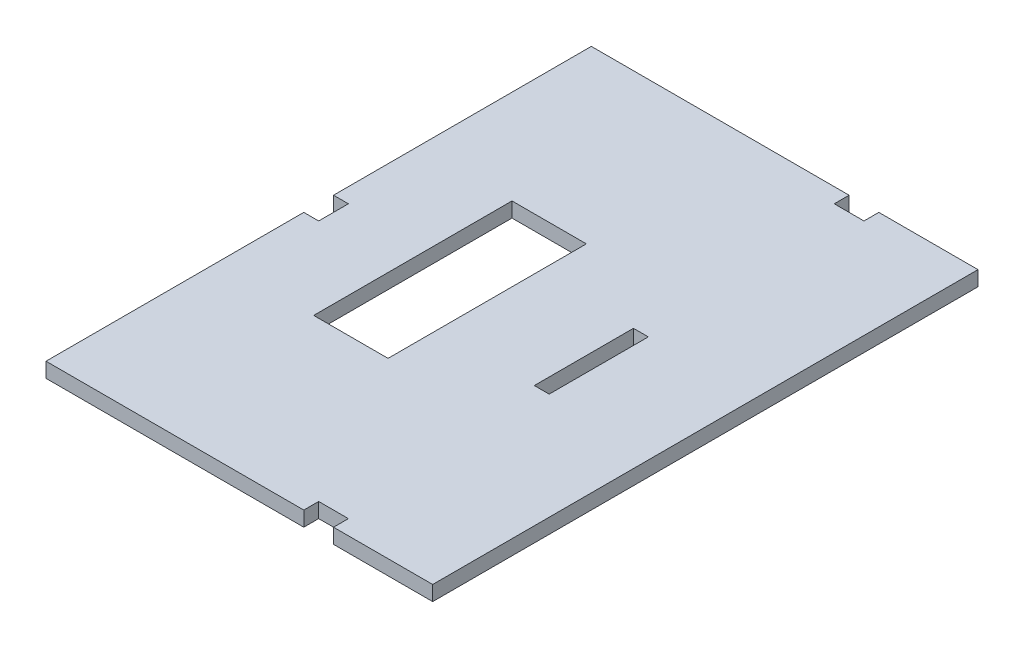
ISO-10303-21;
HEADER;
FILE_DESCRIPTION(('STEP AP214'),'2;1');
FILE_NAME('part.step','',(''),(''),'','','');
FILE_SCHEMA(('AUTOMOTIVE_DESIGN { 1 0 10303 214 1 1 1 1 }'));
ENDSEC;
DATA;
#1=APPLICATION_CONTEXT('core data for automotive mechanical design processes');
#2=APPLICATION_PROTOCOL_DEFINITION('international standard','automotive_design',2000,#1);
#3=PRODUCT_CONTEXT('',#1,'mechanical');
#4=PRODUCT('Part','Part','',(#3));
#5=PRODUCT_RELATED_PRODUCT_CATEGORY('part','',(#4));
#6=PRODUCT_DEFINITION_FORMATION('','',#4);
#7=PRODUCT_DEFINITION_CONTEXT('part definition',#1,'design');
#8=PRODUCT_DEFINITION('design','',#6,#7);
#9=PRODUCT_DEFINITION_SHAPE('','',#8);
#10=(LENGTH_UNIT() NAMED_UNIT(*) SI_UNIT(.MILLI.,.METRE.));
#11=(NAMED_UNIT(*) PLANE_ANGLE_UNIT() SI_UNIT($,.RADIAN.));
#12=(NAMED_UNIT(*) SI_UNIT($,.STERADIAN.) SOLID_ANGLE_UNIT());
#13=UNCERTAINTY_MEASURE_WITH_UNIT(LENGTH_MEASURE(1.E-05),#10,'distance_accuracy_value','');
#14=(GEOMETRIC_REPRESENTATION_CONTEXT(3) GLOBAL_UNCERTAINTY_ASSIGNED_CONTEXT((#13)) GLOBAL_UNIT_ASSIGNED_CONTEXT((#10,
#11,#12)) REPRESENTATION_CONTEXT('',''));
#15=CARTESIAN_POINT('',(0.,0.,0.));
#16=DIRECTION('',(0.,0.,1.));
#17=DIRECTION('',(1.,0.,0.));
#18=AXIS2_PLACEMENT_3D('',#15,#16,#17);
#19=CARTESIAN_POINT('',(0.,3.,-107.));
#20=DIRECTION('',(0.,0.,-1.));
#21=DIRECTION('',(-1.,0.,0.));
#22=AXIS2_PLACEMENT_3D('',#19,#20,#21);
#23=PLANE('',#22);
#24=DIRECTION('',(1.,0.,0.));
#25=VECTOR('',#24,1.);
#26=CARTESIAN_POINT('',(0.,0.,-107.));
#27=LINE('',#26,#25);
#28=CARTESIAN_POINT('',(52.,0.,-107.));
#29=VERTEX_POINT('',#28);
#30=CARTESIAN_POINT('',(58.,0.,-107.));
#31=VERTEX_POINT('',#30);
#32=EDGE_CURVE('E398',#29,#31,#27,.T.);
#33=ORIENTED_EDGE('',*,*,#32,.F.);
#34=DIRECTION('',(0.,-1.,0.));
#35=VECTOR('',#34,1.);
#36=CARTESIAN_POINT('',(52.,3.,-107.));
#37=LINE('',#36,#35);
#38=CARTESIAN_POINT('',(52.,3.,-107.));
#39=VERTEX_POINT('',#38);
#40=EDGE_CURVE('E12',#39,#29,#37,.T.);
#41=ORIENTED_EDGE('',*,*,#40,.F.);
#42=DIRECTION('',(1.,0.,0.));
#43=VECTOR('',#42,1.);
#44=CARTESIAN_POINT('',(0.,3.,-107.));
#45=LINE('',#44,#43);
#46=CARTESIAN_POINT('',(58.,3.,-107.));
#47=VERTEX_POINT('',#46);
#48=EDGE_CURVE('E367',#39,#47,#45,.T.);
#49=ORIENTED_EDGE('',*,*,#48,.T.);
#50=DIRECTION('',(0.,-1.,0.));
#51=VECTOR('',#50,1.);
#52=CARTESIAN_POINT('',(58.,3.,-107.));
#53=LINE('',#52,#51);
#54=EDGE_CURVE('E459',#47,#31,#53,.T.);
#55=ORIENTED_EDGE('',*,*,#54,.T.);
#56=EDGE_LOOP('',(#33,#41,#49,#55));
#57=FACE_BOUND('',#56,.T.);
#58=ADVANCED_FACE('F134',(#57),#23,.T.);
#59=CARTESIAN_POINT('',(0.,0.,0.));
#60=DIRECTION('',(0.,1.,0.));
#61=DIRECTION('',(0.,0.,1.));
#62=AXIS2_PLACEMENT_3D('',#59,#60,#61);
#63=PLANE('',#62);
#64=DIRECTION('',(-1.,0.,0.));
#65=VECTOR('',#64,1.);
#66=CARTESIAN_POINT('',(0.,0.,-75.));
#67=LINE('',#66,#65);
#68=CARTESIAN_POINT('',(34.,0.,-75.0000000000001));
#69=VERTEX_POINT('',#68);
#70=CARTESIAN_POINT('',(19.,0.,-75.));
#71=VERTEX_POINT('',#70);
#72=EDGE_CURVE('E360',#69,#71,#67,.T.);
#73=ORIENTED_EDGE('',*,*,#72,.T.);
#74=DIRECTION('',(0.,0.,1.));
#75=VECTOR('',#74,1.);
#76=CARTESIAN_POINT('',(19.,0.,0.));
#77=LINE('',#76,#75);
#78=CARTESIAN_POINT('',(19.,0.,-35.));
#79=VERTEX_POINT('',#78);
#80=EDGE_CURVE('E363',#71,#79,#77,.T.);
#81=ORIENTED_EDGE('',*,*,#80,.T.);
#82=DIRECTION('',(1.,0.,0.));
#83=VECTOR('',#82,1.);
#84=CARTESIAN_POINT('',(0.,0.,-35.));
#85=LINE('',#84,#83);
#86=CARTESIAN_POINT('',(34.,0.,-35.));
#87=VERTEX_POINT('',#86);
#88=EDGE_CURVE('E357',#79,#87,#85,.T.);
#89=ORIENTED_EDGE('',*,*,#88,.T.);
#90=DIRECTION('',(0.,0.,-1.));
#91=VECTOR('',#90,1.);
#92=CARTESIAN_POINT('',(34.,0.,0.));
#93=LINE('',#92,#91);
#94=EDGE_CURVE('E301',#87,#69,#93,.T.);
#95=ORIENTED_EDGE('',*,*,#94,.T.);
#96=EDGE_LOOP('',(#73,#81,#89,#95));
#97=FACE_BOUND('',#96,.T.);
#98=DIRECTION('',(-1.,0.,0.));
#99=VECTOR('',#98,1.);
#100=CARTESIAN_POINT('',(-6.01370805005288E-13,0.,-64.9999999999995));
#101=LINE('',#100,#99);
#102=CARTESIAN_POINT('',(56.5,0.,-65.));
#103=VERTEX_POINT('',#102);
#104=CARTESIAN_POINT('',(53.5,0.,-65.));
#105=VERTEX_POINT('',#104);
#106=EDGE_CURVE('E351',#103,#105,#101,.T.);
#107=ORIENTED_EDGE('',*,*,#106,.T.);
#108=DIRECTION('',(0.,0.,1.));
#109=VECTOR('',#108,1.);
#110=CARTESIAN_POINT('',(53.5,0.,0.));
#111=LINE('',#110,#109);
#112=CARTESIAN_POINT('',(53.5,0.,-45.));
#113=VERTEX_POINT('',#112);
#114=EDGE_CURVE('E354',#105,#113,#111,.T.);
#115=ORIENTED_EDGE('',*,*,#114,.T.);
#116=DIRECTION('',(1.,0.,0.));
#117=VECTOR('',#116,1.);
#118=CARTESIAN_POINT('',(5.20417042793048E-13,0.,-45.0000000000007));
#119=LINE('',#118,#117);
#120=CARTESIAN_POINT('',(56.5,0.,-45.));
#121=VERTEX_POINT('',#120);
#122=EDGE_CURVE('E325',#113,#121,#119,.T.);
#123=ORIENTED_EDGE('',*,*,#122,.T.);
#124=DIRECTION('',(0.,0.,-1.));
#125=VECTOR('',#124,1.);
#126=CARTESIAN_POINT('',(56.5,0.,0.));
#127=LINE('',#126,#125);
#128=EDGE_CURVE('E348',#121,#103,#127,.T.);
#129=ORIENTED_EDGE('',*,*,#128,.T.);
#130=EDGE_LOOP('',(#107,#115,#123,#129));
#131=FACE_BOUND('',#130,.T.);
#132=ORIENTED_EDGE('',*,*,#32,.T.);
#133=DIRECTION('',(0.,0.,-1.));
#134=VECTOR('',#133,1.);
#135=CARTESIAN_POINT('',(58.,0.,-107.));
#136=LINE('',#135,#134);
#137=CARTESIAN_POINT('',(58.,0.,-110.));
#138=VERTEX_POINT('',#137);
#139=EDGE_CURVE('E448',#31,#138,#136,.T.);
#140=ORIENTED_EDGE('',*,*,#139,.T.);
#141=DIRECTION('',(1.,0.,0.));
#142=VECTOR('',#141,1.);
#143=CARTESIAN_POINT('',(58.,0.,-110.));
#144=LINE('',#143,#142);
#145=CARTESIAN_POINT('',(78.,0.,-110.));
#146=VERTEX_POINT('',#145);
#147=EDGE_CURVE('E467',#138,#146,#144,.T.);
#148=ORIENTED_EDGE('',*,*,#147,.T.);
#149=DIRECTION('',(0.,0.,1.));
#150=VECTOR('',#149,1.);
#151=CARTESIAN_POINT('',(78.,0.,-110.));
#152=LINE('',#151,#150);
#153=CARTESIAN_POINT('',(78.,0.,0.));
#154=VERTEX_POINT('',#153);
#155=EDGE_CURVE('E464',#146,#154,#152,.T.);
#156=ORIENTED_EDGE('',*,*,#155,.T.);
#157=DIRECTION('',(1.,0.,0.));
#158=VECTOR('',#157,1.);
#159=CARTESIAN_POINT('',(58.,0.,0.));
#160=LINE('',#159,#158);
#161=CARTESIAN_POINT('',(58.,0.,0.));
#162=VERTEX_POINT('',#161);
#163=EDGE_CURVE('E461',#162,#154,#160,.T.);
#164=ORIENTED_EDGE('',*,*,#163,.F.);
#165=DIRECTION('',(0.,0.,1.));
#166=VECTOR('',#165,1.);
#167=CARTESIAN_POINT('',(58.,0.,-3.));
#168=LINE('',#167,#166);
#169=CARTESIAN_POINT('',(58.,0.,-3.));
#170=VERTEX_POINT('',#169);
#171=EDGE_CURVE('E366',#170,#162,#168,.T.);
#172=ORIENTED_EDGE('',*,*,#171,.F.);
#173=DIRECTION('',(-1.,0.,0.));
#174=VECTOR('',#173,1.);
#175=CARTESIAN_POINT('',(0.,0.,-3.));
#176=LINE('',#175,#174);
#177=CARTESIAN_POINT('',(52.,0.,-3.));
#178=VERTEX_POINT('',#177);
#179=EDGE_CURVE('E370',#170,#178,#176,.T.);
#180=ORIENTED_EDGE('',*,*,#179,.T.);
#181=DIRECTION('',(0.,0.,1.));
#182=VECTOR('',#181,1.);
#183=CARTESIAN_POINT('',(52.,0.,-2.40548322002117E-13));
#184=LINE('',#183,#182);
#185=CARTESIAN_POINT('',(52.,0.,0.));
#186=VERTEX_POINT('',#185);
#187=EDGE_CURVE('E424',#178,#186,#184,.T.);
#188=ORIENTED_EDGE('',*,*,#187,.T.);
#189=DIRECTION('',(1.,0.,0.));
#190=VECTOR('',#189,1.);
#191=CARTESIAN_POINT('',(0.,0.,0.));
#192=LINE('',#191,#190);
#193=CARTESIAN_POINT('',(0.,0.,0.));
#194=VERTEX_POINT('',#193);
#195=EDGE_CURVE('E421',#194,#186,#192,.T.);
#196=ORIENTED_EDGE('',*,*,#195,.F.);
#197=DIRECTION('',(0.,0.,-1.));
#198=VECTOR('',#197,1.);
#199=CARTESIAN_POINT('',(0.,0.,0.));
#200=LINE('',#199,#198);
#201=CARTESIAN_POINT('',(0.,0.,-52.));
#202=VERTEX_POINT('',#201);
#203=EDGE_CURVE('E418',#194,#202,#200,.T.);
#204=ORIENTED_EDGE('',*,*,#203,.T.);
#205=DIRECTION('',(-1.,0.,0.));
#206=VECTOR('',#205,1.);
#207=CARTESIAN_POINT('',(0.,0.,-52.));
#208=LINE('',#207,#206);
#209=CARTESIAN_POINT('',(3.,0.,-52.));
#210=VERTEX_POINT('',#209);
#211=EDGE_CURVE('E415',#210,#202,#208,.T.);
#212=ORIENTED_EDGE('',*,*,#211,.F.);
#213=DIRECTION('',(0.,0.,-1.));
#214=VECTOR('',#213,1.);
#215=CARTESIAN_POINT('',(3.,0.,0.));
#216=LINE('',#215,#214);
#217=CARTESIAN_POINT('',(3.,0.,-58.));
#218=VERTEX_POINT('',#217);
#219=EDGE_CURVE('E412',#210,#218,#216,.T.);
#220=ORIENTED_EDGE('',*,*,#219,.T.);
#221=DIRECTION('',(-1.,0.,0.));
#222=VECTOR('',#221,1.);
#223=CARTESIAN_POINT('',(0.,0.,-58.));
#224=LINE('',#223,#222);
#225=CARTESIAN_POINT('',(0.,0.,-58.));
#226=VERTEX_POINT('',#225);
#227=EDGE_CURVE('E409',#218,#226,#224,.T.);
#228=ORIENTED_EDGE('',*,*,#227,.T.);
#229=DIRECTION('',(0.,0.,-1.));
#230=VECTOR('',#229,1.);
#231=CARTESIAN_POINT('',(0.,0.,0.));
#232=LINE('',#231,#230);
#233=CARTESIAN_POINT('',(0.,0.,-110.));
#234=VERTEX_POINT('',#233);
#235=EDGE_CURVE('E406',#226,#234,#232,.T.);
#236=ORIENTED_EDGE('',*,*,#235,.T.);
#237=DIRECTION('',(1.,0.,0.));
#238=VECTOR('',#237,1.);
#239=CARTESIAN_POINT('',(0.,0.,-110.));
#240=LINE('',#239,#238);
#241=CARTESIAN_POINT('',(52.,0.,-110.));
#242=VERTEX_POINT('',#241);
#243=EDGE_CURVE('E403',#234,#242,#240,.T.);
#244=ORIENTED_EDGE('',*,*,#243,.T.);
#245=DIRECTION('',(0.,0.,-1.));
#246=VECTOR('',#245,1.);
#247=CARTESIAN_POINT('',(51.9999999999995,0.,2.40548322002115E-13));
#248=LINE('',#247,#246);
#249=EDGE_CURVE('E400',#29,#242,#248,.T.);
#250=ORIENTED_EDGE('',*,*,#249,.F.);
#251=EDGE_LOOP('',(#132,#140,#148,#156,#164,#172,#180,#188,#196,#204,#212,#220,#228,#236,#244,#250));
#252=FACE_BOUND('',#251,.T.);
#253=ADVANCED_FACE('F492',(#97,#131,#252),#63,.F.);
#254=CARTESIAN_POINT('',(0.,3.,-3.));
#255=DIRECTION('',(0.,0.,1.));
#256=DIRECTION('',(1.,0.,0.));
#257=AXIS2_PLACEMENT_3D('',#254,#255,#256);
#258=PLANE('',#257);
#259=ORIENTED_EDGE('',*,*,#179,.F.);
#260=DIRECTION('',(0.,-1.,0.));
#261=VECTOR('',#260,1.);
#262=CARTESIAN_POINT('',(58.,3.,-3.));
#263=LINE('',#262,#261);
#264=CARTESIAN_POINT('',(58.,3.,-3.));
#265=VERTEX_POINT('',#264);
#266=EDGE_CURVE('E138',#265,#170,#263,.T.);
#267=ORIENTED_EDGE('',*,*,#266,.F.);
#268=DIRECTION('',(-1.,0.,0.));
#269=VECTOR('',#268,1.);
#270=CARTESIAN_POINT('',(0.,3.,-3.));
#271=LINE('',#270,#269);
#272=CARTESIAN_POINT('',(52.,3.,-3.));
#273=VERTEX_POINT('',#272);
#274=EDGE_CURVE('E394',#265,#273,#271,.T.);
#275=ORIENTED_EDGE('',*,*,#274,.T.);
#276=DIRECTION('',(0.,-1.,0.));
#277=VECTOR('',#276,1.);
#278=CARTESIAN_POINT('',(52.,3.,-3.));
#279=LINE('',#278,#277);
#280=EDGE_CURVE('E397',#273,#178,#279,.T.);
#281=ORIENTED_EDGE('',*,*,#280,.T.);
#282=EDGE_LOOP('',(#259,#267,#275,#281));
#283=FACE_BOUND('',#282,.T.);
#284=ADVANCED_FACE('F551',(#283),#258,.T.);
#285=CARTESIAN_POINT('',(52.,3.,-2.40548322002117E-13));
#286=DIRECTION('',(1.,0.,0.));
#287=DIRECTION('',(0.,0.,-1.));
#288=AXIS2_PLACEMENT_3D('',#285,#286,#287);
#289=PLANE('',#288);
#290=ORIENTED_EDGE('',*,*,#187,.F.);
#291=ORIENTED_EDGE('',*,*,#280,.F.);
#292=DIRECTION('',(0.,0.,1.));
#293=VECTOR('',#292,1.);
#294=CARTESIAN_POINT('',(52.,3.,-2.40548322002117E-13));
#295=LINE('',#294,#293);
#296=CARTESIAN_POINT('',(52.,3.,0.));
#297=VERTEX_POINT('',#296);
#298=EDGE_CURVE('E391',#273,#297,#295,.T.);
#299=ORIENTED_EDGE('',*,*,#298,.T.);
#300=DIRECTION('',(0.,-1.,0.));
#301=VECTOR('',#300,1.);
#302=CARTESIAN_POINT('',(52.,3.,0.));
#303=LINE('',#302,#301);
#304=EDGE_CURVE('E430',#297,#186,#303,.T.);
#305=ORIENTED_EDGE('',*,*,#304,.T.);
#306=EDGE_LOOP('',(#290,#291,#299,#305));
#307=FACE_BOUND('',#306,.T.);
#308=ADVANCED_FACE('F550',(#307),#289,.T.);
#309=CARTESIAN_POINT('',(0.,3.,0.));
#310=DIRECTION('',(0.,0.,-1.));
#311=DIRECTION('',(-1.,0.,0.));
#312=AXIS2_PLACEMENT_3D('',#309,#310,#311);
#313=PLANE('',#312);
#314=ORIENTED_EDGE('',*,*,#195,.T.);
#315=ORIENTED_EDGE('',*,*,#304,.F.);
#316=DIRECTION('',(1.,0.,0.));
#317=VECTOR('',#316,1.);
#318=CARTESIAN_POINT('',(0.,3.,0.));
#319=LINE('',#318,#317);
#320=CARTESIAN_POINT('',(0.,3.,0.));
#321=VERTEX_POINT('',#320);
#322=EDGE_CURVE('E389',#321,#297,#319,.T.);
#323=ORIENTED_EDGE('',*,*,#322,.F.);
#324=DIRECTION('',(0.,-1.,0.));
#325=VECTOR('',#324,1.);
#326=CARTESIAN_POINT('',(0.,3.,0.));
#327=LINE('',#326,#325);
#328=EDGE_CURVE('E432',#321,#194,#327,.T.);
#329=ORIENTED_EDGE('',*,*,#328,.T.);
#330=EDGE_LOOP('',(#314,#315,#323,#329));
#331=FACE_BOUND('',#330,.T.);
#332=ADVANCED_FACE('F547',(#331),#313,.F.);
#333=CARTESIAN_POINT('',(0.,3.,0.));
#334=DIRECTION('',(-1.,0.,0.));
#335=DIRECTION('',(0.,0.,1.));
#336=AXIS2_PLACEMENT_3D('',#333,#334,#335);
#337=PLANE('',#336);
#338=ORIENTED_EDGE('',*,*,#203,.F.);
#339=ORIENTED_EDGE('',*,*,#328,.F.);
#340=DIRECTION('',(0.,0.,-1.));
#341=VECTOR('',#340,1.);
#342=CARTESIAN_POINT('',(0.,3.,0.));
#343=LINE('',#342,#341);
#344=CARTESIAN_POINT('',(0.,3.,-52.));
#345=VERTEX_POINT('',#344);
#346=EDGE_CURVE('E386',#321,#345,#343,.T.);
#347=ORIENTED_EDGE('',*,*,#346,.T.);
#348=DIRECTION('',(0.,-1.,0.));
#349=VECTOR('',#348,1.);
#350=CARTESIAN_POINT('',(0.,3.,-52.));
#351=LINE('',#350,#349);
#352=EDGE_CURVE('E434',#345,#202,#351,.T.);
#353=ORIENTED_EDGE('',*,*,#352,.T.);
#354=EDGE_LOOP('',(#338,#339,#347,#353));
#355=FACE_BOUND('',#354,.T.);
#356=ADVANCED_FACE('F544',(#355),#337,.T.);
#357=CARTESIAN_POINT('',(0.,3.,-52.));
#358=DIRECTION('',(0.,0.,1.));
#359=DIRECTION('',(1.,0.,0.));
#360=AXIS2_PLACEMENT_3D('',#357,#358,#359);
#361=PLANE('',#360);
#362=ORIENTED_EDGE('',*,*,#211,.T.);
#363=ORIENTED_EDGE('',*,*,#352,.F.);
#364=DIRECTION('',(-1.,0.,0.));
#365=VECTOR('',#364,1.);
#366=CARTESIAN_POINT('',(0.,3.,-52.));
#367=LINE('',#366,#365);
#368=CARTESIAN_POINT('',(3.,3.,-52.));
#369=VERTEX_POINT('',#368);
#370=EDGE_CURVE('E384',#369,#345,#367,.T.);
#371=ORIENTED_EDGE('',*,*,#370,.F.);
#372=DIRECTION('',(0.,-1.,0.));
#373=VECTOR('',#372,1.);
#374=CARTESIAN_POINT('',(3.,3.,-52.));
#375=LINE('',#374,#373);
#376=EDGE_CURVE('E436',#369,#210,#375,.T.);
#377=ORIENTED_EDGE('',*,*,#376,.T.);
#378=EDGE_LOOP('',(#362,#363,#371,#377));
#379=FACE_BOUND('',#378,.T.);
#380=ADVANCED_FACE('F537',(#379),#361,.F.);
#381=CARTESIAN_POINT('',(3.,3.,0.));
#382=DIRECTION('',(-1.,0.,0.));
#383=DIRECTION('',(0.,0.,1.));
#384=AXIS2_PLACEMENT_3D('',#381,#382,#383);
#385=PLANE('',#384);
#386=ORIENTED_EDGE('',*,*,#219,.F.);
#387=ORIENTED_EDGE('',*,*,#376,.F.);
#388=DIRECTION('',(0.,0.,-1.));
#389=VECTOR('',#388,1.);
#390=CARTESIAN_POINT('',(3.,3.,0.));
#391=LINE('',#390,#389);
#392=CARTESIAN_POINT('',(3.,3.,-58.));
#393=VERTEX_POINT('',#392);
#394=EDGE_CURVE('E381',#369,#393,#391,.T.);
#395=ORIENTED_EDGE('',*,*,#394,.T.);
#396=DIRECTION('',(0.,-1.,0.));
#397=VECTOR('',#396,1.);
#398=CARTESIAN_POINT('',(3.,3.,-58.));
#399=LINE('',#398,#397);
#400=EDGE_CURVE('E438',#393,#218,#399,.T.);
#401=ORIENTED_EDGE('',*,*,#400,.T.);
#402=EDGE_LOOP('',(#386,#387,#395,#401));
#403=FACE_BOUND('',#402,.T.);
#404=ADVANCED_FACE('F532',(#403),#385,.T.);
#405=CARTESIAN_POINT('',(0.,3.,-58.));
#406=DIRECTION('',(0.,0.,1.));
#407=DIRECTION('',(1.,0.,0.));
#408=AXIS2_PLACEMENT_3D('',#405,#406,#407);
#409=PLANE('',#408);
#410=ORIENTED_EDGE('',*,*,#227,.F.);
#411=ORIENTED_EDGE('',*,*,#400,.F.);
#412=DIRECTION('',(-1.,0.,0.));
#413=VECTOR('',#412,1.);
#414=CARTESIAN_POINT('',(0.,3.,-58.));
#415=LINE('',#414,#413);
#416=CARTESIAN_POINT('',(0.,3.,-58.));
#417=VERTEX_POINT('',#416);
#418=EDGE_CURVE('E378',#393,#417,#415,.T.);
#419=ORIENTED_EDGE('',*,*,#418,.T.);
#420=DIRECTION('',(0.,-1.,0.));
#421=VECTOR('',#420,1.);
#422=CARTESIAN_POINT('',(0.,3.,-58.));
#423=LINE('',#422,#421);
#424=EDGE_CURVE('E440',#417,#226,#423,.T.);
#425=ORIENTED_EDGE('',*,*,#424,.T.);
#426=EDGE_LOOP('',(#410,#411,#419,#425));
#427=FACE_BOUND('',#426,.T.);
#428=ADVANCED_FACE('F528',(#427),#409,.T.);
#429=CARTESIAN_POINT('',(0.,3.,0.));
#430=DIRECTION('',(-1.,0.,0.));
#431=DIRECTION('',(0.,0.,1.));
#432=AXIS2_PLACEMENT_3D('',#429,#430,#431);
#433=PLANE('',#432);
#434=ORIENTED_EDGE('',*,*,#235,.F.);
#435=ORIENTED_EDGE('',*,*,#424,.F.);
#436=DIRECTION('',(0.,0.,-1.));
#437=VECTOR('',#436,1.);
#438=CARTESIAN_POINT('',(0.,3.,0.));
#439=LINE('',#438,#437);
#440=CARTESIAN_POINT('',(0.,3.,-110.));
#441=VERTEX_POINT('',#440);
#442=EDGE_CURVE('E375',#417,#441,#439,.T.);
#443=ORIENTED_EDGE('',*,*,#442,.T.);
#444=DIRECTION('',(0.,-1.,0.));
#445=VECTOR('',#444,1.);
#446=CARTESIAN_POINT('',(0.,3.,-110.));
#447=LINE('',#446,#445);
#448=EDGE_CURVE('E442',#441,#234,#447,.T.);
#449=ORIENTED_EDGE('',*,*,#448,.T.);
#450=EDGE_LOOP('',(#434,#435,#443,#449));
#451=FACE_BOUND('',#450,.T.);
#452=ADVANCED_FACE('F525',(#451),#433,.T.);
#453=CARTESIAN_POINT('',(0.,3.,-110.));
#454=DIRECTION('',(0.,0.,-1.));
#455=DIRECTION('',(-1.,0.,0.));
#456=AXIS2_PLACEMENT_3D('',#453,#454,#455);
#457=PLANE('',#456);
#458=ORIENTED_EDGE('',*,*,#243,.F.);
#459=ORIENTED_EDGE('',*,*,#448,.F.);
#460=DIRECTION('',(1.,0.,0.));
#461=VECTOR('',#460,1.);
#462=CARTESIAN_POINT('',(0.,3.,-110.));
#463=LINE('',#462,#461);
#464=CARTESIAN_POINT('',(52.,3.,-110.));
#465=VERTEX_POINT('',#464);
#466=EDGE_CURVE('E372',#441,#465,#463,.T.);
#467=ORIENTED_EDGE('',*,*,#466,.T.);
#468=DIRECTION('',(0.,-1.,0.));
#469=VECTOR('',#468,1.);
#470=CARTESIAN_POINT('',(52.,3.,-110.));
#471=LINE('',#470,#469);
#472=EDGE_CURVE('E143',#465,#242,#471,.T.);
#473=ORIENTED_EDGE('',*,*,#472,.T.);
#474=EDGE_LOOP('',(#458,#459,#467,#473));
#475=FACE_BOUND('',#474,.T.);
#476=ADVANCED_FACE('F520',(#475),#457,.T.);
#477=CARTESIAN_POINT('',(51.9999999999995,3.,2.40548322002115E-13));
#478=DIRECTION('',(-1.,0.,0.));
#479=DIRECTION('',(0.,0.,1.));
#480=AXIS2_PLACEMENT_3D('',#477,#478,#479);
#481=PLANE('',#480);
#482=ORIENTED_EDGE('',*,*,#249,.T.);
#483=ORIENTED_EDGE('',*,*,#472,.F.);
#484=DIRECTION('',(0.,0.,-1.));
#485=VECTOR('',#484,1.);
#486=CARTESIAN_POINT('',(51.9999999999995,3.,2.40548322002115E-13));
#487=LINE('',#486,#485);
#488=EDGE_CURVE('E369',#39,#465,#487,.T.);
#489=ORIENTED_EDGE('',*,*,#488,.F.);
#490=ORIENTED_EDGE('',*,*,#40,.T.);
#491=EDGE_LOOP('',(#482,#483,#489,#490));
#492=FACE_BOUND('',#491,.T.);
#493=ADVANCED_FACE('F517',(#492),#481,.F.);
#494=CARTESIAN_POINT('',(0.,3.,0.));
#495=DIRECTION('',(0.,1.,0.));
#496=DIRECTION('',(0.,0.,1.));
#497=AXIS2_PLACEMENT_3D('',#494,#495,#496);
#498=PLANE('',#497);
#499=DIRECTION('',(0.,0.,1.));
#500=VECTOR('',#499,1.);
#501=CARTESIAN_POINT('',(19.,3.,-75.));
#502=LINE('',#501,#500);
#503=CARTESIAN_POINT('',(19.,3.,-75.));
#504=VERTEX_POINT('',#503);
#505=CARTESIAN_POINT('',(19.,3.,-35.));
#506=VERTEX_POINT('',#505);
#507=EDGE_CURVE('E313',#504,#506,#502,.T.);
#508=ORIENTED_EDGE('',*,*,#507,.F.);
#509=DIRECTION('',(-1.,0.,0.));
#510=VECTOR('',#509,1.);
#511=CARTESIAN_POINT('',(19.,3.,-75.));
#512=LINE('',#511,#510);
#513=CARTESIAN_POINT('',(34.,3.,-75.0000000000001));
#514=VERTEX_POINT('',#513);
#515=EDGE_CURVE('E318',#514,#504,#512,.T.);
#516=ORIENTED_EDGE('',*,*,#515,.F.);
#517=DIRECTION('',(0.,0.,-1.));
#518=VECTOR('',#517,1.);
#519=CARTESIAN_POINT('',(34.,3.,-75.0000000000001));
#520=LINE('',#519,#518);
#521=CARTESIAN_POINT('',(34.,3.,-35.));
#522=VERTEX_POINT('',#521);
#523=EDGE_CURVE('E298',#522,#514,#520,.T.);
#524=ORIENTED_EDGE('',*,*,#523,.F.);
#525=DIRECTION('',(1.,0.,0.));
#526=VECTOR('',#525,1.);
#527=CARTESIAN_POINT('',(19.,3.,-35.));
#528=LINE('',#527,#526);
#529=EDGE_CURVE('E308',#506,#522,#528,.T.);
#530=ORIENTED_EDGE('',*,*,#529,.F.);
#531=EDGE_LOOP('',(#508,#516,#524,#530));
#532=FACE_BOUND('',#531,.T.);
#533=DIRECTION('',(0.,0.,1.));
#534=VECTOR('',#533,1.);
#535=CARTESIAN_POINT('',(53.5,3.,-65.));
#536=LINE('',#535,#534);
#537=CARTESIAN_POINT('',(53.5,3.,-65.));
#538=VERTEX_POINT('',#537);
#539=CARTESIAN_POINT('',(53.5,3.,-45.));
#540=VERTEX_POINT('',#539);
#541=EDGE_CURVE('E344',#538,#540,#536,.T.);
#542=ORIENTED_EDGE('',*,*,#541,.F.);
#543=DIRECTION('',(-1.,0.,0.));
#544=VECTOR('',#543,1.);
#545=CARTESIAN_POINT('',(53.5,3.,-65.));
#546=LINE('',#545,#544);
#547=CARTESIAN_POINT('',(56.5,3.,-65.));
#548=VERTEX_POINT('',#547);
#549=EDGE_CURVE('E331',#548,#538,#546,.T.);
#550=ORIENTED_EDGE('',*,*,#549,.F.);
#551=DIRECTION('',(0.,0.,-1.));
#552=VECTOR('',#551,1.);
#553=CARTESIAN_POINT('',(56.5,3.,-65.));
#554=LINE('',#553,#552);
#555=CARTESIAN_POINT('',(56.5,3.,-45.));
#556=VERTEX_POINT('',#555);
#557=EDGE_CURVE('E339',#556,#548,#554,.T.);
#558=ORIENTED_EDGE('',*,*,#557,.F.);
#559=DIRECTION('',(1.,0.,0.));
#560=VECTOR('',#559,1.);
#561=CARTESIAN_POINT('',(53.5,3.,-45.));
#562=LINE('',#561,#560);
#563=EDGE_CURVE('E342',#540,#556,#562,.T.);
#564=ORIENTED_EDGE('',*,*,#563,.F.);
#565=EDGE_LOOP('',(#542,#550,#558,#564));
#566=FACE_BOUND('',#565,.T.);
#567=ORIENTED_EDGE('',*,*,#274,.F.);
#568=DIRECTION('',(0.,0.,1.));
#569=VECTOR('',#568,1.);
#570=CARTESIAN_POINT('',(58.,3.,-3.));
#571=LINE('',#570,#569);
#572=CARTESIAN_POINT('',(58.,3.,0.));
#573=VERTEX_POINT('',#572);
#574=EDGE_CURVE('E445',#265,#573,#571,.T.);
#575=ORIENTED_EDGE('',*,*,#574,.T.);
#576=DIRECTION('',(1.,0.,0.));
#577=VECTOR('',#576,1.);
#578=CARTESIAN_POINT('',(58.,3.,0.));
#579=LINE('',#578,#577);
#580=CARTESIAN_POINT('',(78.,3.,0.));
#581=VERTEX_POINT('',#580);
#582=EDGE_CURVE('E447',#573,#581,#579,.T.);
#583=ORIENTED_EDGE('',*,*,#582,.T.);
#584=DIRECTION('',(0.,0.,1.));
#585=VECTOR('',#584,1.);
#586=CARTESIAN_POINT('',(78.,3.,-110.));
#587=LINE('',#586,#585);
#588=CARTESIAN_POINT('',(78.,3.,-110.));
#589=VERTEX_POINT('',#588);
#590=EDGE_CURVE('E450',#589,#581,#587,.T.);
#591=ORIENTED_EDGE('',*,*,#590,.F.);
#592=DIRECTION('',(1.,0.,0.));
#593=VECTOR('',#592,1.);
#594=CARTESIAN_POINT('',(58.,3.,-110.));
#595=LINE('',#594,#593);
#596=CARTESIAN_POINT('',(58.,3.,-110.));
#597=VERTEX_POINT('',#596);
#598=EDGE_CURVE('E453',#597,#589,#595,.T.);
#599=ORIENTED_EDGE('',*,*,#598,.F.);
#600=DIRECTION('',(0.,0.,-1.));
#601=VECTOR('',#600,1.);
#602=CARTESIAN_POINT('',(58.,3.,-107.));
#603=LINE('',#602,#601);
#604=EDGE_CURVE('E456',#47,#597,#603,.T.);
#605=ORIENTED_EDGE('',*,*,#604,.F.);
#606=ORIENTED_EDGE('',*,*,#48,.F.);
#607=ORIENTED_EDGE('',*,*,#488,.T.);
#608=ORIENTED_EDGE('',*,*,#466,.F.);
#609=ORIENTED_EDGE('',*,*,#442,.F.);
#610=ORIENTED_EDGE('',*,*,#418,.F.);
#611=ORIENTED_EDGE('',*,*,#394,.F.);
#612=ORIENTED_EDGE('',*,*,#370,.T.);
#613=ORIENTED_EDGE('',*,*,#346,.F.);
#614=ORIENTED_EDGE('',*,*,#322,.T.);
#615=ORIENTED_EDGE('',*,*,#298,.F.);
#616=EDGE_LOOP('',(#567,#575,#583,#591,#599,#605,#606,#607,#608,#609,#610,#611,#612,#613,#614,#615));
#617=FACE_BOUND('',#616,.T.);
#618=ADVANCED_FACE('F315',(#532,#566,#617),#498,.T.);
#619=CARTESIAN_POINT('',(58.,3.,-3.));
#620=DIRECTION('',(1.,0.,0.));
#621=DIRECTION('',(0.,0.,-1.));
#622=AXIS2_PLACEMENT_3D('',#619,#620,#621);
#623=PLANE('',#622);
#624=ORIENTED_EDGE('',*,*,#171,.T.);
#625=DIRECTION('',(0.,-1.,0.));
#626=VECTOR('',#625,1.);
#627=CARTESIAN_POINT('',(58.,3.,0.));
#628=LINE('',#627,#626);
#629=EDGE_CURVE('E479',#573,#162,#628,.T.);
#630=ORIENTED_EDGE('',*,*,#629,.F.);
#631=ORIENTED_EDGE('',*,*,#574,.F.);
#632=ORIENTED_EDGE('',*,*,#266,.T.);
#633=EDGE_LOOP('',(#624,#630,#631,#632));
#634=FACE_BOUND('',#633,.T.);
#635=ADVANCED_FACE('F136',(#634),#623,.F.);
#636=CARTESIAN_POINT('',(58.,3.,0.));
#637=DIRECTION('',(0.,0.,-1.));
#638=DIRECTION('',(-1.,0.,0.));
#639=AXIS2_PLACEMENT_3D('',#636,#637,#638);
#640=PLANE('',#639);
#641=ORIENTED_EDGE('',*,*,#163,.T.);
#642=DIRECTION('',(0.,-1.,0.));
#643=VECTOR('',#642,1.);
#644=CARTESIAN_POINT('',(78.,3.,0.));
#645=LINE('',#644,#643);
#646=EDGE_CURVE('E478',#581,#154,#645,.T.);
#647=ORIENTED_EDGE('',*,*,#646,.F.);
#648=ORIENTED_EDGE('',*,*,#582,.F.);
#649=ORIENTED_EDGE('',*,*,#629,.T.);
#650=EDGE_LOOP('',(#641,#647,#648,#649));
#651=FACE_BOUND('',#650,.T.);
#652=ADVANCED_FACE('F495',(#651),#640,.F.);
#653=CARTESIAN_POINT('',(78.,3.,-110.));
#654=DIRECTION('',(1.,0.,0.));
#655=DIRECTION('',(0.,0.,-1.));
#656=AXIS2_PLACEMENT_3D('',#653,#654,#655);
#657=PLANE('',#656);
#658=ORIENTED_EDGE('',*,*,#155,.F.);
#659=DIRECTION('',(0.,-1.,0.));
#660=VECTOR('',#659,1.);
#661=CARTESIAN_POINT('',(78.,3.,-110.));
#662=LINE('',#661,#660);
#663=EDGE_CURVE('E476',#589,#146,#662,.T.);
#664=ORIENTED_EDGE('',*,*,#663,.F.);
#665=ORIENTED_EDGE('',*,*,#590,.T.);
#666=ORIENTED_EDGE('',*,*,#646,.T.);
#667=EDGE_LOOP('',(#658,#664,#665,#666));
#668=FACE_BOUND('',#667,.T.);
#669=ADVANCED_FACE('F498',(#668),#657,.T.);
#670=CARTESIAN_POINT('',(58.,3.,-110.));
#671=DIRECTION('',(0.,0.,-1.));
#672=DIRECTION('',(-1.,0.,0.));
#673=AXIS2_PLACEMENT_3D('',#670,#671,#672);
#674=PLANE('',#673);
#675=ORIENTED_EDGE('',*,*,#147,.F.);
#676=DIRECTION('',(0.,-1.,0.));
#677=VECTOR('',#676,1.);
#678=CARTESIAN_POINT('',(58.,3.,-110.));
#679=LINE('',#678,#677);
#680=EDGE_CURVE('E474',#597,#138,#679,.T.);
#681=ORIENTED_EDGE('',*,*,#680,.F.);
#682=ORIENTED_EDGE('',*,*,#598,.T.);
#683=ORIENTED_EDGE('',*,*,#663,.T.);
#684=EDGE_LOOP('',(#675,#681,#682,#683));
#685=FACE_BOUND('',#684,.T.);
#686=ADVANCED_FACE('F504',(#685),#674,.T.);
#687=CARTESIAN_POINT('',(58.,3.,-107.));
#688=DIRECTION('',(-1.,0.,0.));
#689=DIRECTION('',(0.,0.,1.));
#690=AXIS2_PLACEMENT_3D('',#687,#688,#689);
#691=PLANE('',#690);
#692=ORIENTED_EDGE('',*,*,#139,.F.);
#693=ORIENTED_EDGE('',*,*,#54,.F.);
#694=ORIENTED_EDGE('',*,*,#604,.T.);
#695=ORIENTED_EDGE('',*,*,#680,.T.);
#696=EDGE_LOOP('',(#692,#693,#694,#695));
#697=FACE_BOUND('',#696,.T.);
#698=ADVANCED_FACE('F507',(#697),#691,.T.);
#699=CARTESIAN_POINT('',(53.5,-7.,-65.));
#700=DIRECTION('',(-1.,0.,0.));
#701=DIRECTION('',(0.,0.,1.));
#702=AXIS2_PLACEMENT_3D('',#699,#700,#701);
#703=PLANE('',#702);
#704=DIRECTION('',(0.,1.,0.));
#705=VECTOR('',#704,1.);
#706=CARTESIAN_POINT('',(53.5,-7.,-65.));
#707=LINE('',#706,#705);
#708=EDGE_CURVE('E335',#105,#538,#707,.T.);
#709=ORIENTED_EDGE('',*,*,#708,.T.);
#710=ORIENTED_EDGE('',*,*,#541,.T.);
#711=DIRECTION('',(0.,1.,0.));
#712=VECTOR('',#711,1.);
#713=CARTESIAN_POINT('',(53.5,-7.,-45.));
#714=LINE('',#713,#712);
#715=EDGE_CURVE('E328',#113,#540,#714,.T.);
#716=ORIENTED_EDGE('',*,*,#715,.F.);
#717=ORIENTED_EDGE('',*,*,#114,.F.);
#718=EDGE_LOOP('',(#709,#710,#716,#717));
#719=FACE_BOUND('',#718,.T.);
#720=ADVANCED_FACE('F570',(#719),#703,.F.);
#721=CARTESIAN_POINT('',(53.5,-7.,-65.));
#722=DIRECTION('',(0.,0.,-1.));
#723=DIRECTION('',(-1.,0.,0.));
#724=AXIS2_PLACEMENT_3D('',#721,#722,#723);
#725=PLANE('',#724);
#726=DIRECTION('',(0.,1.,0.));
#727=VECTOR('',#726,1.);
#728=CARTESIAN_POINT('',(56.5,-7.,-65.));
#729=LINE('',#728,#727);
#730=EDGE_CURVE('E333',#103,#548,#729,.T.);
#731=ORIENTED_EDGE('',*,*,#730,.T.);
#732=ORIENTED_EDGE('',*,*,#549,.T.);
#733=ORIENTED_EDGE('',*,*,#708,.F.);
#734=ORIENTED_EDGE('',*,*,#106,.F.);
#735=EDGE_LOOP('',(#731,#732,#733,#734));
#736=FACE_BOUND('',#735,.T.);
#737=ADVANCED_FACE('F586',(#736),#725,.F.);
#738=CARTESIAN_POINT('',(56.5,-7.,-65.));
#739=DIRECTION('',(1.,0.,0.));
#740=DIRECTION('',(0.,0.,-1.));
#741=AXIS2_PLACEMENT_3D('',#738,#739,#740);
#742=PLANE('',#741);
#743=DIRECTION('',(0.,1.,0.));
#744=VECTOR('',#743,1.);
#745=CARTESIAN_POINT('',(56.5,-7.,-45.));
#746=LINE('',#745,#744);
#747=EDGE_CURVE('E159',#121,#556,#746,.T.);
#748=ORIENTED_EDGE('',*,*,#747,.T.);
#749=ORIENTED_EDGE('',*,*,#557,.T.);
#750=ORIENTED_EDGE('',*,*,#730,.F.);
#751=ORIENTED_EDGE('',*,*,#128,.F.);
#752=EDGE_LOOP('',(#748,#749,#750,#751));
#753=FACE_BOUND('',#752,.T.);
#754=ADVANCED_FACE('F589',(#753),#742,.F.);
#755=CARTESIAN_POINT('',(53.5,-7.,-45.));
#756=DIRECTION('',(0.,0.,1.));
#757=DIRECTION('',(1.,0.,0.));
#758=AXIS2_PLACEMENT_3D('',#755,#756,#757);
#759=PLANE('',#758);
#760=ORIENTED_EDGE('',*,*,#715,.T.);
#761=ORIENTED_EDGE('',*,*,#563,.T.);
#762=ORIENTED_EDGE('',*,*,#747,.F.);
#763=ORIENTED_EDGE('',*,*,#122,.F.);
#764=EDGE_LOOP('',(#760,#761,#762,#763));
#765=FACE_BOUND('',#764,.T.);
#766=ADVANCED_FACE('F593',(#765),#759,.F.);
#767=CARTESIAN_POINT('',(19.,-7.,-75.));
#768=DIRECTION('',(-1.,0.,0.));
#769=DIRECTION('',(0.,0.,1.));
#770=AXIS2_PLACEMENT_3D('',#767,#768,#769);
#771=PLANE('',#770);
#772=DIRECTION('',(0.,1.,0.));
#773=VECTOR('',#772,1.);
#774=CARTESIAN_POINT('',(19.,-7.,-75.));
#775=LINE('',#774,#773);
#776=EDGE_CURVE('E323',#71,#504,#775,.T.);
#777=ORIENTED_EDGE('',*,*,#776,.T.);
#778=ORIENTED_EDGE('',*,*,#507,.T.);
#779=DIRECTION('',(0.,1.,0.));
#780=VECTOR('',#779,1.);
#781=CARTESIAN_POINT('',(19.,-7.,-35.));
#782=LINE('',#781,#780);
#783=EDGE_CURVE('E304',#79,#506,#782,.T.);
#784=ORIENTED_EDGE('',*,*,#783,.F.);
#785=ORIENTED_EDGE('',*,*,#80,.F.);
#786=EDGE_LOOP('',(#777,#778,#784,#785));
#787=FACE_BOUND('',#786,.T.);
#788=ADVANCED_FACE('F597',(#787),#771,.F.);
#789=CARTESIAN_POINT('',(19.,-7.,-75.));
#790=DIRECTION('',(0.,0.,-1.));
#791=DIRECTION('',(-1.,0.,0.));
#792=AXIS2_PLACEMENT_3D('',#789,#790,#791);
#793=PLANE('',#792);
#794=DIRECTION('',(0.,1.,0.));
#795=VECTOR('',#794,1.);
#796=CARTESIAN_POINT('',(34.,-7.,-75.0000000000001));
#797=LINE('',#796,#795);
#798=EDGE_CURVE('E303',#69,#514,#797,.T.);
#799=ORIENTED_EDGE('',*,*,#798,.T.);
#800=ORIENTED_EDGE('',*,*,#515,.T.);
#801=ORIENTED_EDGE('',*,*,#776,.F.);
#802=ORIENTED_EDGE('',*,*,#72,.F.);
#803=EDGE_LOOP('',(#799,#800,#801,#802));
#804=FACE_BOUND('',#803,.T.);
#805=ADVANCED_FACE('F603',(#804),#793,.F.);
#806=CARTESIAN_POINT('',(34.,-7.,-75.0000000000001));
#807=DIRECTION('',(1.,0.,0.));
#808=DIRECTION('',(0.,0.,-1.));
#809=AXIS2_PLACEMENT_3D('',#806,#807,#808);
#810=PLANE('',#809);
#811=DIRECTION('',(0.,1.,0.));
#812=VECTOR('',#811,1.);
#813=CARTESIAN_POINT('',(34.,-7.,-35.));
#814=LINE('',#813,#812);
#815=EDGE_CURVE('E151',#87,#522,#814,.T.);
#816=ORIENTED_EDGE('',*,*,#815,.T.);
#817=ORIENTED_EDGE('',*,*,#523,.T.);
#818=ORIENTED_EDGE('',*,*,#798,.F.);
#819=ORIENTED_EDGE('',*,*,#94,.F.);
#820=EDGE_LOOP('',(#816,#817,#818,#819));
#821=FACE_BOUND('',#820,.T.);
#822=ADVANCED_FACE('F295',(#821),#810,.F.);
#823=CARTESIAN_POINT('',(19.,-7.,-35.));
#824=DIRECTION('',(0.,0.,1.));
#825=DIRECTION('',(1.,0.,0.));
#826=AXIS2_PLACEMENT_3D('',#823,#824,#825);
#827=PLANE('',#826);
#828=ORIENTED_EDGE('',*,*,#783,.T.);
#829=ORIENTED_EDGE('',*,*,#529,.T.);
#830=ORIENTED_EDGE('',*,*,#815,.F.);
#831=ORIENTED_EDGE('',*,*,#88,.F.);
#832=EDGE_LOOP('',(#828,#829,#830,#831));
#833=FACE_BOUND('',#832,.T.);
#834=ADVANCED_FACE('F309',(#833),#827,.F.);
#835=CLOSED_SHELL('',(#58,#253,#284,#308,#332,#356,#380,#404,#428,#452,#476,#493,#618,#635,#652,
#669,#686,#698,#720,#737,#754,#766,#788,#805,#822,#834));
#836=MANIFOLD_SOLID_BREP('B2',#835);
#837=ADVANCED_BREP_SHAPE_REPRESENTATION('',(#18,#836),#14);
#838=SHAPE_DEFINITION_REPRESENTATION(#9,#837);
ENDSEC;
END-ISO-10303-21;
